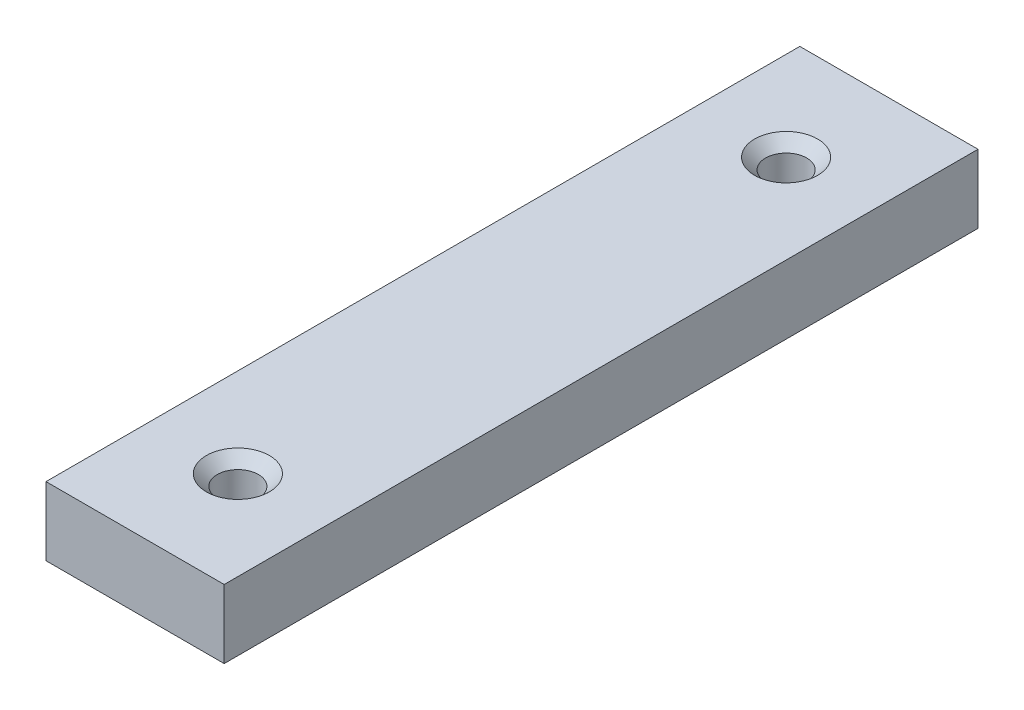
ISO-10303-21;
HEADER;
FILE_DESCRIPTION(('STEP AP214'),'2;1');
FILE_NAME('part.step','',(''),(''),'','','');
FILE_SCHEMA(('AUTOMOTIVE_DESIGN { 1 0 10303 214 1 1 1 1 }'));
ENDSEC;
DATA;
#1=APPLICATION_CONTEXT('core data for automotive mechanical design processes');
#2=APPLICATION_PROTOCOL_DEFINITION('international standard','automotive_design',2000,#1);
#3=PRODUCT_CONTEXT('',#1,'mechanical');
#4=PRODUCT('Part','Part','',(#3));
#5=PRODUCT_RELATED_PRODUCT_CATEGORY('part','',(#4));
#6=PRODUCT_DEFINITION_FORMATION('','',#4);
#7=PRODUCT_DEFINITION_CONTEXT('part definition',#1,'design');
#8=PRODUCT_DEFINITION('design','',#6,#7);
#9=PRODUCT_DEFINITION_SHAPE('','',#8);
#10=(LENGTH_UNIT() NAMED_UNIT(*) SI_UNIT(.MILLI.,.METRE.));
#11=(NAMED_UNIT(*) PLANE_ANGLE_UNIT() SI_UNIT($,.RADIAN.));
#12=(NAMED_UNIT(*) SI_UNIT($,.STERADIAN.) SOLID_ANGLE_UNIT());
#13=UNCERTAINTY_MEASURE_WITH_UNIT(LENGTH_MEASURE(1.E-05),#10,'distance_accuracy_value','');
#14=(GEOMETRIC_REPRESENTATION_CONTEXT(3) GLOBAL_UNCERTAINTY_ASSIGNED_CONTEXT((#13)) GLOBAL_UNIT_ASSIGNED_CONTEXT((#10,
#11,#12)) REPRESENTATION_CONTEXT('',''));
#15=CARTESIAN_POINT('',(0.,0.,0.));
#16=DIRECTION('',(0.,0.,1.));
#17=DIRECTION('',(1.,0.,0.));
#18=AXIS2_PLACEMENT_3D('',#15,#16,#17);
#19=CARTESIAN_POINT('',(13.,5.,55.));
#20=DIRECTION('',(-1.,0.,0.));
#21=DIRECTION('',(0.,0.,1.));
#22=AXIS2_PLACEMENT_3D('',#19,#20,#21);
#23=PLANE('',#22);
#24=DIRECTION('',(0.,0.,-1.));
#25=VECTOR('',#24,1.);
#26=CARTESIAN_POINT('',(13.,-5.,55.));
#27=LINE('',#26,#25);
#28=CARTESIAN_POINT('',(13.,-5.,55.));
#29=VERTEX_POINT('',#28);
#30=CARTESIAN_POINT('',(13.,-5.,-55.));
#31=VERTEX_POINT('',#30);
#32=EDGE_CURVE('E107',#29,#31,#27,.T.);
#33=ORIENTED_EDGE('',*,*,#32,.T.);
#34=DIRECTION('',(0.,-1.,0.));
#35=VECTOR('',#34,1.);
#36=CARTESIAN_POINT('',(13.,5.,-55.));
#37=LINE('',#36,#35);
#38=CARTESIAN_POINT('',(13.,5.,-55.));
#39=VERTEX_POINT('',#38);
#40=EDGE_CURVE('E98',#39,#31,#37,.T.);
#41=ORIENTED_EDGE('',*,*,#40,.F.);
#42=DIRECTION('',(0.,0.,-1.));
#43=VECTOR('',#42,1.);
#44=CARTESIAN_POINT('',(13.,5.,55.));
#45=LINE('',#44,#43);
#46=CARTESIAN_POINT('',(13.,5.,55.));
#47=VERTEX_POINT('',#46);
#48=EDGE_CURVE('E92',#47,#39,#45,.T.);
#49=ORIENTED_EDGE('',*,*,#48,.F.);
#50=DIRECTION('',(0.,-1.,0.));
#51=VECTOR('',#50,1.);
#52=CARTESIAN_POINT('',(13.,5.,55.));
#53=LINE('',#52,#51);
#54=EDGE_CURVE('E103',#47,#29,#53,.T.);
#55=ORIENTED_EDGE('',*,*,#54,.T.);
#56=EDGE_LOOP('',(#33,#41,#49,#55));
#57=FACE_BOUND('',#56,.T.);
#58=ADVANCED_FACE('F38',(#57),#23,.F.);
#59=CARTESIAN_POINT('',(-13.,5.,-55.));
#60=DIRECTION('',(0.,0.,1.));
#61=DIRECTION('',(1.,0.,0.));
#62=AXIS2_PLACEMENT_3D('',#59,#60,#61);
#63=PLANE('',#62);
#64=DIRECTION('',(-1.,0.,0.));
#65=VECTOR('',#64,1.);
#66=CARTESIAN_POINT('',(-13.,-5.,-55.));
#67=LINE('',#66,#65);
#68=CARTESIAN_POINT('',(-13.,-5.,-55.));
#69=VERTEX_POINT('',#68);
#70=EDGE_CURVE('E97',#31,#69,#67,.T.);
#71=ORIENTED_EDGE('',*,*,#70,.T.);
#72=DIRECTION('',(0.,-1.,0.));
#73=VECTOR('',#72,1.);
#74=CARTESIAN_POINT('',(-13.,5.,-55.));
#75=LINE('',#74,#73);
#76=CARTESIAN_POINT('',(-13.,5.,-55.));
#77=VERTEX_POINT('',#76);
#78=EDGE_CURVE('E95',#77,#69,#75,.T.);
#79=ORIENTED_EDGE('',*,*,#78,.F.);
#80=DIRECTION('',(-1.,0.,0.));
#81=VECTOR('',#80,1.);
#82=CARTESIAN_POINT('',(-13.,5.,-55.));
#83=LINE('',#82,#81);
#84=EDGE_CURVE('E87',#39,#77,#83,.T.);
#85=ORIENTED_EDGE('',*,*,#84,.F.);
#86=ORIENTED_EDGE('',*,*,#40,.T.);
#87=EDGE_LOOP('',(#71,#79,#85,#86));
#88=FACE_BOUND('',#87,.T.);
#89=ADVANCED_FACE('F96',(#88),#63,.F.);
#90=CARTESIAN_POINT('',(-13.,5.,55.));
#91=DIRECTION('',(1.,0.,0.));
#92=DIRECTION('',(0.,0.,-1.));
#93=AXIS2_PLACEMENT_3D('',#90,#91,#92);
#94=PLANE('',#93);
#95=DIRECTION('',(0.,0.,1.));
#96=VECTOR('',#95,1.);
#97=CARTESIAN_POINT('',(-13.,-5.,55.));
#98=LINE('',#97,#96);
#99=CARTESIAN_POINT('',(-13.,-5.,55.));
#100=VERTEX_POINT('',#99);
#101=EDGE_CURVE('E73',#69,#100,#98,.T.);
#102=ORIENTED_EDGE('',*,*,#101,.T.);
#103=DIRECTION('',(0.,-1.,0.));
#104=VECTOR('',#103,1.);
#105=CARTESIAN_POINT('',(-13.,5.,55.));
#106=LINE('',#105,#104);
#107=CARTESIAN_POINT('',(-13.,5.,55.));
#108=VERTEX_POINT('',#107);
#109=EDGE_CURVE('E99',#108,#100,#106,.T.);
#110=ORIENTED_EDGE('',*,*,#109,.F.);
#111=DIRECTION('',(0.,0.,1.));
#112=VECTOR('',#111,1.);
#113=CARTESIAN_POINT('',(-13.,5.,55.));
#114=LINE('',#113,#112);
#115=EDGE_CURVE('E90',#77,#108,#114,.T.);
#116=ORIENTED_EDGE('',*,*,#115,.F.);
#117=ORIENTED_EDGE('',*,*,#78,.T.);
#118=EDGE_LOOP('',(#102,#110,#116,#117));
#119=FACE_BOUND('',#118,.T.);
#120=ADVANCED_FACE('F101',(#119),#94,.F.);
#121=CARTESIAN_POINT('',(-13.,5.,55.));
#122=DIRECTION('',(0.,0.,-1.));
#123=DIRECTION('',(-1.,0.,0.));
#124=AXIS2_PLACEMENT_3D('',#121,#122,#123);
#125=PLANE('',#124);
#126=DIRECTION('',(1.,0.,0.));
#127=VECTOR('',#126,1.);
#128=CARTESIAN_POINT('',(-13.,-5.,55.));
#129=LINE('',#128,#127);
#130=EDGE_CURVE('E79',#100,#29,#129,.T.);
#131=ORIENTED_EDGE('',*,*,#130,.T.);
#132=ORIENTED_EDGE('',*,*,#54,.F.);
#133=DIRECTION('',(1.,0.,0.));
#134=VECTOR('',#133,1.);
#135=CARTESIAN_POINT('',(-13.,5.,55.));
#136=LINE('',#135,#134);
#137=EDGE_CURVE('E56',#108,#47,#136,.T.);
#138=ORIENTED_EDGE('',*,*,#137,.F.);
#139=ORIENTED_EDGE('',*,*,#109,.T.);
#140=EDGE_LOOP('',(#131,#132,#138,#139));
#141=FACE_BOUND('',#140,.T.);
#142=ADVANCED_FACE('F168',(#141),#125,.F.);
#143=CARTESIAN_POINT('',(0.,5.,0.));
#144=DIRECTION('',(0.,-1.,0.));
#145=DIRECTION('',(0.,0.,-1.));
#146=AXIS2_PLACEMENT_3D('',#143,#144,#145);
#147=PLANE('',#146);
#148=CARTESIAN_POINT('',(0.,5.,40.));
#149=DIRECTION('',(0.,-1.,0.));
#150=DIRECTION('',(0.,0.,-1.));
#151=AXIS2_PLACEMENT_3D('',#148,#149,#150);
#152=CIRCLE('',#151,4.60000000000001);
#153=CARTESIAN_POINT('',(0.,5.,35.4));
#154=VERTEX_POINT('',#153);
#155=EDGE_CURVE('E48',#154,#154,#152,.T.);
#156=ORIENTED_EDGE('',*,*,#155,.T.);
#157=EDGE_LOOP('',(#156));
#158=FACE_BOUND('',#157,.T.);
#159=CARTESIAN_POINT('',(0.,5.,-40.));
#160=DIRECTION('',(0.,-1.,0.));
#161=DIRECTION('',(0.,0.,-1.));
#162=AXIS2_PLACEMENT_3D('',#159,#160,#161);
#163=CIRCLE('',#162,4.60000000000001);
#164=CARTESIAN_POINT('',(0.,5.,-44.6));
#165=VERTEX_POINT('',#164);
#166=EDGE_CURVE('E120',#165,#165,#163,.T.);
#167=ORIENTED_EDGE('',*,*,#166,.T.);
#168=EDGE_LOOP('',(#167));
#169=FACE_BOUND('',#168,.T.);
#170=ORIENTED_EDGE('',*,*,#48,.T.);
#171=ORIENTED_EDGE('',*,*,#84,.T.);
#172=ORIENTED_EDGE('',*,*,#115,.T.);
#173=ORIENTED_EDGE('',*,*,#137,.T.);
#174=EDGE_LOOP('',(#170,#171,#172,#173));
#175=FACE_BOUND('',#174,.T.);
#176=ADVANCED_FACE('F88',(#158,#169,#175),#147,.F.);
#177=CARTESIAN_POINT('',(0.,-5.,0.));
#178=DIRECTION('',(0.,-1.,0.));
#179=DIRECTION('',(0.,0.,-1.));
#180=AXIS2_PLACEMENT_3D('',#177,#178,#179);
#181=PLANE('',#180);
#182=CARTESIAN_POINT('',(0.,-5.,-40.));
#183=DIRECTION('',(0.,-1.,0.));
#184=DIRECTION('',(0.,0.,-1.));
#185=AXIS2_PLACEMENT_3D('',#182,#183,#184);
#186=CIRCLE('',#185,3.);
#187=CARTESIAN_POINT('',(0.,-5.,-43.));
#188=VERTEX_POINT('',#187);
#189=EDGE_CURVE('E110',#188,#188,#186,.F.);
#190=ORIENTED_EDGE('',*,*,#189,.T.);
#191=EDGE_LOOP('',(#190));
#192=FACE_BOUND('',#191,.T.);
#193=CARTESIAN_POINT('',(0.,-5.,40.));
#194=DIRECTION('',(0.,-1.,0.));
#195=DIRECTION('',(0.,0.,-1.));
#196=AXIS2_PLACEMENT_3D('',#193,#194,#195);
#197=CIRCLE('',#196,3.);
#198=CARTESIAN_POINT('',(0.,-5.,37.));
#199=VERTEX_POINT('',#198);
#200=EDGE_CURVE('E140',#199,#199,#197,.F.);
#201=ORIENTED_EDGE('',*,*,#200,.T.);
#202=EDGE_LOOP('',(#201));
#203=FACE_BOUND('',#202,.T.);
#204=ORIENTED_EDGE('',*,*,#32,.F.);
#205=ORIENTED_EDGE('',*,*,#130,.F.);
#206=ORIENTED_EDGE('',*,*,#101,.F.);
#207=ORIENTED_EDGE('',*,*,#70,.F.);
#208=EDGE_LOOP('',(#204,#205,#206,#207));
#209=FACE_BOUND('',#208,.T.);
#210=ADVANCED_FACE('F136',(#192,#203,#209),#181,.T.);
#211=CARTESIAN_POINT('',(0.,-5.001,40.));
#212=DIRECTION('',(0.,1.,0.));
#213=DIRECTION('',(0.,0.,1.));
#214=AXIS2_PLACEMENT_3D('',#211,#212,#213);
#215=CYLINDRICAL_SURFACE('',#214,3.);
#216=CARTESIAN_POINT('',(0.,3.4,40.));
#217=DIRECTION('',(0.,-1.,0.));
#218=DIRECTION('',(0.,0.,-1.));
#219=AXIS2_PLACEMENT_3D('',#216,#217,#218);
#220=CIRCLE('',#219,3.);
#221=CARTESIAN_POINT('',(0.,3.4,37.));
#222=VERTEX_POINT('',#221);
#223=EDGE_CURVE('E117',#222,#222,#220,.F.);
#224=ORIENTED_EDGE('',*,*,#223,.T.);
#225=EDGE_LOOP('',(#224));
#226=FACE_BOUND('',#225,.T.);
#227=ORIENTED_EDGE('',*,*,#200,.F.);
#228=EDGE_LOOP('',(#227));
#229=FACE_BOUND('',#228,.T.);
#230=ADVANCED_FACE('F133',(#226,#229),#215,.F.);
#231=CARTESIAN_POINT('',(0.,-5.001,-40.));
#232=DIRECTION('',(0.,1.,0.));
#233=DIRECTION('',(0.,0.,1.));
#234=AXIS2_PLACEMENT_3D('',#231,#232,#233);
#235=CYLINDRICAL_SURFACE('',#234,3.);
#236=CARTESIAN_POINT('',(0.,3.4,-40.));
#237=DIRECTION('',(0.,-1.,0.));
#238=DIRECTION('',(0.,0.,-1.));
#239=AXIS2_PLACEMENT_3D('',#236,#237,#238);
#240=CIRCLE('',#239,3.);
#241=CARTESIAN_POINT('',(0.,3.4,-43.));
#242=VERTEX_POINT('',#241);
#243=EDGE_CURVE('E11',#242,#242,#240,.F.);
#244=ORIENTED_EDGE('',*,*,#243,.T.);
#245=EDGE_LOOP('',(#244));
#246=FACE_BOUND('',#245,.T.);
#247=ORIENTED_EDGE('',*,*,#189,.F.);
#248=EDGE_LOOP('',(#247));
#249=FACE_BOUND('',#248,.T.);
#250=ADVANCED_FACE('F130',(#246,#249),#235,.F.);
#251=CARTESIAN_POINT('',(0.,3.4,40.));
#252=DIRECTION('',(0.,1.,0.));
#253=DIRECTION('',(0.,0.,1.));
#254=AXIS2_PLACEMENT_3D('',#251,#252,#253);
#255=CONICAL_SURFACE('',#254,3.,0.78539816339745);
#256=ORIENTED_EDGE('',*,*,#155,.F.);
#257=EDGE_LOOP('',(#256));
#258=FACE_BOUND('',#257,.T.);
#259=ORIENTED_EDGE('',*,*,#223,.F.);
#260=EDGE_LOOP('',(#259));
#261=FACE_BOUND('',#260,.T.);
#262=ADVANCED_FACE('F127',(#258,#261),#255,.F.);
#263=CARTESIAN_POINT('',(0.,3.4,-40.));
#264=DIRECTION('',(0.,1.,0.));
#265=DIRECTION('',(0.,0.,1.));
#266=AXIS2_PLACEMENT_3D('',#263,#264,#265);
#267=CONICAL_SURFACE('',#266,3.,0.78539816339745);
#268=ORIENTED_EDGE('',*,*,#166,.F.);
#269=EDGE_LOOP('',(#268));
#270=FACE_BOUND('',#269,.T.);
#271=ORIENTED_EDGE('',*,*,#243,.F.);
#272=EDGE_LOOP('',(#271));
#273=FACE_BOUND('',#272,.T.);
#274=ADVANCED_FACE('F41',(#270,#273),#267,.F.);
#275=CLOSED_SHELL('',(#58,#89,#120,#142,#176,#210,#230,#250,#262,#274));
#276=MANIFOLD_SOLID_BREP('B2',#275);
#277=ADVANCED_BREP_SHAPE_REPRESENTATION('',(#18,#276),#14);
#278=SHAPE_DEFINITION_REPRESENTATION(#9,#277);
ENDSEC;
END-ISO-10303-21;
